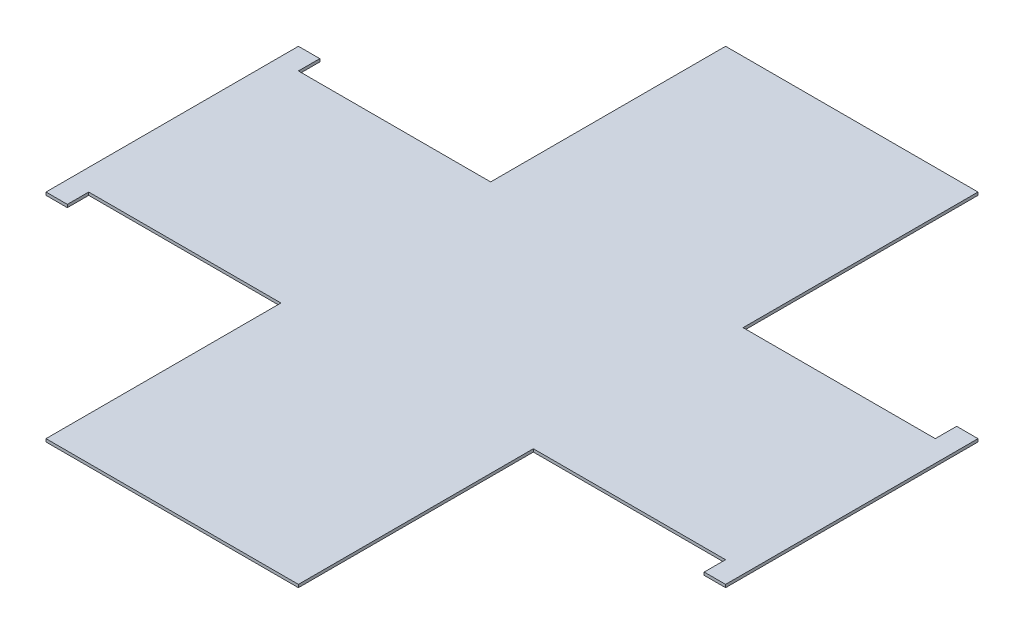
ISO-10303-21;
HEADER;
FILE_DESCRIPTION(('STEP AP214'),'2;1');
FILE_NAME('part.step','',(''),(''),'','','');
FILE_SCHEMA(('AUTOMOTIVE_DESIGN { 1 0 10303 214 1 1 1 1 }'));
ENDSEC;
DATA;
#1=APPLICATION_CONTEXT('core data for automotive mechanical design processes');
#2=APPLICATION_PROTOCOL_DEFINITION('international standard','automotive_design',2000,#1);
#3=PRODUCT_CONTEXT('',#1,'mechanical');
#4=PRODUCT('Part','Part','',(#3));
#5=PRODUCT_RELATED_PRODUCT_CATEGORY('part','',(#4));
#6=PRODUCT_DEFINITION_FORMATION('','',#4);
#7=PRODUCT_DEFINITION_CONTEXT('part definition',#1,'design');
#8=PRODUCT_DEFINITION('design','',#6,#7);
#9=PRODUCT_DEFINITION_SHAPE('','',#8);
#10=(LENGTH_UNIT() NAMED_UNIT(*) SI_UNIT(.MILLI.,.METRE.));
#11=(NAMED_UNIT(*) PLANE_ANGLE_UNIT() SI_UNIT($,.RADIAN.));
#12=(NAMED_UNIT(*) SI_UNIT($,.STERADIAN.) SOLID_ANGLE_UNIT());
#13=UNCERTAINTY_MEASURE_WITH_UNIT(LENGTH_MEASURE(1.E-05),#10,'distance_accuracy_value','');
#14=(GEOMETRIC_REPRESENTATION_CONTEXT(3) GLOBAL_UNCERTAINTY_ASSIGNED_CONTEXT((#13)) GLOBAL_UNIT_ASSIGNED_CONTEXT((#10,
#11,#12)) REPRESENTATION_CONTEXT('',''));
#15=CARTESIAN_POINT('',(0.,0.,0.));
#16=DIRECTION('',(0.,0.,1.));
#17=DIRECTION('',(1.,0.,0.));
#18=AXIS2_PLACEMENT_3D('',#15,#16,#17);
#19=CARTESIAN_POINT('',(-328.,3.,-108.));
#20=DIRECTION('',(0.,0.,1.));
#21=DIRECTION('',(1.,0.,0.));
#22=AXIS2_PLACEMENT_3D('',#19,#20,#21);
#23=PLANE('',#22);
#24=DIRECTION('',(-1.,0.,0.));
#25=VECTOR('',#24,1.);
#26=CARTESIAN_POINT('',(-328.,0.,-108.));
#27=LINE('',#26,#25);
#28=CARTESIAN_POINT('',(-130.,0.,-108.));
#29=VERTEX_POINT('',#28);
#30=CARTESIAN_POINT('',(-328.,0.,-108.));
#31=VERTEX_POINT('',#30);
#32=EDGE_CURVE('E222',#29,#31,#27,.T.);
#33=ORIENTED_EDGE('',*,*,#32,.T.);
#34=DIRECTION('',(0.,-1.,0.));
#35=VECTOR('',#34,1.);
#36=CARTESIAN_POINT('',(-328.,3.,-108.));
#37=LINE('',#36,#35);
#38=CARTESIAN_POINT('',(-328.,3.,-108.));
#39=VERTEX_POINT('',#38);
#40=EDGE_CURVE('E54',#39,#31,#37,.T.);
#41=ORIENTED_EDGE('',*,*,#40,.F.);
#42=DIRECTION('',(-1.,0.,0.));
#43=VECTOR('',#42,1.);
#44=CARTESIAN_POINT('',(-328.,3.,-108.));
#45=LINE('',#44,#43);
#46=CARTESIAN_POINT('',(-130.,3.,-108.));
#47=VERTEX_POINT('',#46);
#48=EDGE_CURVE('E141',#47,#39,#45,.T.);
#49=ORIENTED_EDGE('',*,*,#48,.F.);
#50=DIRECTION('',(0.,-1.,0.));
#51=VECTOR('',#50,1.);
#52=CARTESIAN_POINT('',(-130.,3.,-108.));
#53=LINE('',#52,#51);
#54=EDGE_CURVE('E11',#47,#29,#53,.T.);
#55=ORIENTED_EDGE('',*,*,#54,.T.);
#56=EDGE_LOOP('',(#33,#41,#49,#55));
#57=FACE_BOUND('',#56,.T.);
#58=ADVANCED_FACE('F45',(#57),#23,.F.);
#59=CARTESIAN_POINT('',(-328.,3.,-130.));
#60=DIRECTION('',(-1.,0.,0.));
#61=DIRECTION('',(0.,0.,1.));
#62=AXIS2_PLACEMENT_3D('',#59,#60,#61);
#63=PLANE('',#62);
#64=DIRECTION('',(0.,0.,-1.));
#65=VECTOR('',#64,1.);
#66=CARTESIAN_POINT('',(-328.,0.,-130.));
#67=LINE('',#66,#65);
#68=CARTESIAN_POINT('',(-328.,0.,-130.));
#69=VERTEX_POINT('',#68);
#70=EDGE_CURVE('E225',#31,#69,#67,.T.);
#71=ORIENTED_EDGE('',*,*,#70,.T.);
#72=DIRECTION('',(0.,-1.,0.));
#73=VECTOR('',#72,1.);
#74=CARTESIAN_POINT('',(-328.,3.,-130.));
#75=LINE('',#74,#73);
#76=CARTESIAN_POINT('',(-328.,3.,-130.));
#77=VERTEX_POINT('',#76);
#78=EDGE_CURVE('E339',#77,#69,#75,.T.);
#79=ORIENTED_EDGE('',*,*,#78,.F.);
#80=DIRECTION('',(0.,0.,-1.));
#81=VECTOR('',#80,1.);
#82=CARTESIAN_POINT('',(-328.,3.,-130.));
#83=LINE('',#82,#81);
#84=EDGE_CURVE('E349',#39,#77,#83,.T.);
#85=ORIENTED_EDGE('',*,*,#84,.F.);
#86=ORIENTED_EDGE('',*,*,#40,.T.);
#87=EDGE_LOOP('',(#71,#79,#85,#86));
#88=FACE_BOUND('',#87,.T.);
#89=ADVANCED_FACE('F347',(#88),#63,.F.);
#90=CARTESIAN_POINT('',(-350.,3.,-130.));
#91=DIRECTION('',(0.,0.,1.));
#92=DIRECTION('',(1.,0.,0.));
#93=AXIS2_PLACEMENT_3D('',#90,#91,#92);
#94=PLANE('',#93);
#95=DIRECTION('',(-1.,0.,0.));
#96=VECTOR('',#95,1.);
#97=CARTESIAN_POINT('',(-350.,0.,-130.));
#98=LINE('',#97,#96);
#99=CARTESIAN_POINT('',(-350.,0.,-130.));
#100=VERTEX_POINT('',#99);
#101=EDGE_CURVE('E228',#69,#100,#98,.T.);
#102=ORIENTED_EDGE('',*,*,#101,.T.);
#103=DIRECTION('',(0.,-1.,0.));
#104=VECTOR('',#103,1.);
#105=CARTESIAN_POINT('',(-350.,3.,-130.));
#106=LINE('',#105,#104);
#107=CARTESIAN_POINT('',(-350.,3.,-130.));
#108=VERTEX_POINT('',#107);
#109=EDGE_CURVE('E335',#108,#100,#106,.T.);
#110=ORIENTED_EDGE('',*,*,#109,.F.);
#111=DIRECTION('',(-1.,0.,0.));
#112=VECTOR('',#111,1.);
#113=CARTESIAN_POINT('',(-350.,3.,-130.));
#114=LINE('',#113,#112);
#115=EDGE_CURVE('E369',#77,#108,#114,.T.);
#116=ORIENTED_EDGE('',*,*,#115,.F.);
#117=ORIENTED_EDGE('',*,*,#78,.T.);
#118=EDGE_LOOP('',(#102,#110,#116,#117));
#119=FACE_BOUND('',#118,.T.);
#120=ADVANCED_FACE('F359',(#119),#94,.F.);
#121=CARTESIAN_POINT('',(-350.,3.,130.));
#122=DIRECTION('',(1.,0.,0.));
#123=DIRECTION('',(0.,0.,-1.));
#124=AXIS2_PLACEMENT_3D('',#121,#122,#123);
#125=PLANE('',#124);
#126=DIRECTION('',(0.,0.,1.));
#127=VECTOR('',#126,1.);
#128=CARTESIAN_POINT('',(-350.,0.,130.));
#129=LINE('',#128,#127);
#130=CARTESIAN_POINT('',(-350.,0.,130.));
#131=VERTEX_POINT('',#130);
#132=EDGE_CURVE('E231',#100,#131,#129,.T.);
#133=ORIENTED_EDGE('',*,*,#132,.T.);
#134=DIRECTION('',(0.,-1.,0.));
#135=VECTOR('',#134,1.);
#136=CARTESIAN_POINT('',(-350.,3.,130.));
#137=LINE('',#136,#135);
#138=CARTESIAN_POINT('',(-350.,3.,130.));
#139=VERTEX_POINT('',#138);
#140=EDGE_CURVE('E331',#139,#131,#137,.T.);
#141=ORIENTED_EDGE('',*,*,#140,.F.);
#142=DIRECTION('',(0.,0.,1.));
#143=VECTOR('',#142,1.);
#144=CARTESIAN_POINT('',(-350.,3.,130.));
#145=LINE('',#144,#143);
#146=EDGE_CURVE('E365',#108,#139,#145,.T.);
#147=ORIENTED_EDGE('',*,*,#146,.F.);
#148=ORIENTED_EDGE('',*,*,#109,.T.);
#149=EDGE_LOOP('',(#133,#141,#147,#148));
#150=FACE_BOUND('',#149,.T.);
#151=ADVANCED_FACE('F363',(#150),#125,.F.);
#152=CARTESIAN_POINT('',(-350.,3.,130.));
#153=DIRECTION('',(0.,0.,-1.));
#154=DIRECTION('',(-1.,0.,0.));
#155=AXIS2_PLACEMENT_3D('',#152,#153,#154);
#156=PLANE('',#155);
#157=DIRECTION('',(1.,0.,0.));
#158=VECTOR('',#157,1.);
#159=CARTESIAN_POINT('',(-350.,0.,130.));
#160=LINE('',#159,#158);
#161=CARTESIAN_POINT('',(-328.,0.,130.));
#162=VERTEX_POINT('',#161);
#163=EDGE_CURVE('E234',#131,#162,#160,.T.);
#164=ORIENTED_EDGE('',*,*,#163,.T.);
#165=DIRECTION('',(0.,-1.,0.));
#166=VECTOR('',#165,1.);
#167=CARTESIAN_POINT('',(-328.,3.,130.));
#168=LINE('',#167,#166);
#169=CARTESIAN_POINT('',(-328.,3.,130.));
#170=VERTEX_POINT('',#169);
#171=EDGE_CURVE('E327',#170,#162,#168,.T.);
#172=ORIENTED_EDGE('',*,*,#171,.F.);
#173=DIRECTION('',(1.,0.,0.));
#174=VECTOR('',#173,1.);
#175=CARTESIAN_POINT('',(-350.,3.,130.));
#176=LINE('',#175,#174);
#177=EDGE_CURVE('E368',#139,#170,#176,.T.);
#178=ORIENTED_EDGE('',*,*,#177,.F.);
#179=ORIENTED_EDGE('',*,*,#140,.T.);
#180=EDGE_LOOP('',(#164,#172,#178,#179));
#181=FACE_BOUND('',#180,.T.);
#182=ADVANCED_FACE('F443',(#181),#156,.F.);
#183=CARTESIAN_POINT('',(-328.,3.,108.));
#184=DIRECTION('',(-1.,0.,0.));
#185=DIRECTION('',(0.,0.,1.));
#186=AXIS2_PLACEMENT_3D('',#183,#184,#185);
#187=PLANE('',#186);
#188=DIRECTION('',(0.,0.,-1.));
#189=VECTOR('',#188,1.);
#190=CARTESIAN_POINT('',(-328.,0.,108.));
#191=LINE('',#190,#189);
#192=CARTESIAN_POINT('',(-328.,0.,108.));
#193=VERTEX_POINT('',#192);
#194=EDGE_CURVE('E237',#162,#193,#191,.T.);
#195=ORIENTED_EDGE('',*,*,#194,.T.);
#196=DIRECTION('',(0.,-1.,0.));
#197=VECTOR('',#196,1.);
#198=CARTESIAN_POINT('',(-328.,3.,108.));
#199=LINE('',#198,#197);
#200=CARTESIAN_POINT('',(-328.,3.,108.));
#201=VERTEX_POINT('',#200);
#202=EDGE_CURVE('E323',#201,#193,#199,.T.);
#203=ORIENTED_EDGE('',*,*,#202,.F.);
#204=DIRECTION('',(0.,0.,-1.));
#205=VECTOR('',#204,1.);
#206=CARTESIAN_POINT('',(-328.,3.,108.));
#207=LINE('',#206,#205);
#208=EDGE_CURVE('E373',#170,#201,#207,.T.);
#209=ORIENTED_EDGE('',*,*,#208,.F.);
#210=ORIENTED_EDGE('',*,*,#171,.T.);
#211=EDGE_LOOP('',(#195,#203,#209,#210));
#212=FACE_BOUND('',#211,.T.);
#213=ADVANCED_FACE('F446',(#212),#187,.F.);
#214=CARTESIAN_POINT('',(-328.,3.,108.));
#215=DIRECTION('',(0.,0.,-1.));
#216=DIRECTION('',(-1.,0.,0.));
#217=AXIS2_PLACEMENT_3D('',#214,#215,#216);
#218=PLANE('',#217);
#219=DIRECTION('',(1.,0.,0.));
#220=VECTOR('',#219,1.);
#221=CARTESIAN_POINT('',(-328.,0.,108.));
#222=LINE('',#221,#220);
#223=CARTESIAN_POINT('',(-130.,0.,108.));
#224=VERTEX_POINT('',#223);
#225=EDGE_CURVE('E240',#193,#224,#222,.T.);
#226=ORIENTED_EDGE('',*,*,#225,.T.);
#227=DIRECTION('',(0.,-1.,0.));
#228=VECTOR('',#227,1.);
#229=CARTESIAN_POINT('',(-130.,3.,108.));
#230=LINE('',#229,#228);
#231=CARTESIAN_POINT('',(-130.,3.,108.));
#232=VERTEX_POINT('',#231);
#233=EDGE_CURVE('E319',#232,#224,#230,.T.);
#234=ORIENTED_EDGE('',*,*,#233,.F.);
#235=DIRECTION('',(1.,0.,0.));
#236=VECTOR('',#235,1.);
#237=CARTESIAN_POINT('',(-328.,3.,108.));
#238=LINE('',#237,#236);
#239=EDGE_CURVE('E380',#201,#232,#238,.T.);
#240=ORIENTED_EDGE('',*,*,#239,.F.);
#241=ORIENTED_EDGE('',*,*,#202,.T.);
#242=EDGE_LOOP('',(#226,#234,#240,#241));
#243=FACE_BOUND('',#242,.T.);
#244=ADVANCED_FACE('F450',(#243),#218,.F.);
#245=CARTESIAN_POINT('',(-130.,3.,130.));
#246=DIRECTION('',(1.,0.,0.));
#247=DIRECTION('',(0.,0.,-1.));
#248=AXIS2_PLACEMENT_3D('',#245,#246,#247);
#249=PLANE('',#248);
#250=DIRECTION('',(0.,0.,1.));
#251=VECTOR('',#250,1.);
#252=CARTESIAN_POINT('',(-130.,0.,130.));
#253=LINE('',#252,#251);
#254=CARTESIAN_POINT('',(-130.,0.,350.));
#255=VERTEX_POINT('',#254);
#256=EDGE_CURVE('E244',#224,#255,#253,.T.);
#257=ORIENTED_EDGE('',*,*,#256,.T.);
#258=DIRECTION('',(0.,-1.,0.));
#259=VECTOR('',#258,1.);
#260=CARTESIAN_POINT('',(-130.,3.,350.));
#261=LINE('',#260,#259);
#262=CARTESIAN_POINT('',(-130.,3.,350.));
#263=VERTEX_POINT('',#262);
#264=EDGE_CURVE('E315',#263,#255,#261,.T.);
#265=ORIENTED_EDGE('',*,*,#264,.F.);
#266=DIRECTION('',(0.,0.,1.));
#267=VECTOR('',#266,1.);
#268=CARTESIAN_POINT('',(-130.,3.,108.));
#269=LINE('',#268,#267);
#270=EDGE_CURVE('E383',#232,#263,#269,.T.);
#271=ORIENTED_EDGE('',*,*,#270,.F.);
#272=ORIENTED_EDGE('',*,*,#233,.T.);
#273=EDGE_LOOP('',(#257,#265,#271,#272));
#274=FACE_BOUND('',#273,.T.);
#275=ADVANCED_FACE('F454',(#274),#249,.F.);
#276=CARTESIAN_POINT('',(-130.,3.,350.));
#277=DIRECTION('',(0.,0.,-1.));
#278=DIRECTION('',(-1.,0.,0.));
#279=AXIS2_PLACEMENT_3D('',#276,#277,#278);
#280=PLANE('',#279);
#281=DIRECTION('',(1.,0.,0.));
#282=VECTOR('',#281,1.);
#283=CARTESIAN_POINT('',(-130.,0.,350.));
#284=LINE('',#283,#282);
#285=CARTESIAN_POINT('',(130.,0.,350.));
#286=VERTEX_POINT('',#285);
#287=EDGE_CURVE('E247',#255,#286,#284,.T.);
#288=ORIENTED_EDGE('',*,*,#287,.T.);
#289=DIRECTION('',(0.,-1.,0.));
#290=VECTOR('',#289,1.);
#291=CARTESIAN_POINT('',(130.,3.,350.));
#292=LINE('',#291,#290);
#293=CARTESIAN_POINT('',(130.,3.,350.));
#294=VERTEX_POINT('',#293);
#295=EDGE_CURVE('E311',#294,#286,#292,.T.);
#296=ORIENTED_EDGE('',*,*,#295,.F.);
#297=DIRECTION('',(1.,0.,0.));
#298=VECTOR('',#297,1.);
#299=CARTESIAN_POINT('',(-130.,3.,350.));
#300=LINE('',#299,#298);
#301=EDGE_CURVE('E386',#263,#294,#300,.T.);
#302=ORIENTED_EDGE('',*,*,#301,.F.);
#303=ORIENTED_EDGE('',*,*,#264,.T.);
#304=EDGE_LOOP('',(#288,#296,#302,#303));
#305=FACE_BOUND('',#304,.T.);
#306=ADVANCED_FACE('F458',(#305),#280,.F.);
#307=CARTESIAN_POINT('',(130.,3.,108.));
#308=DIRECTION('',(-1.,0.,0.));
#309=DIRECTION('',(0.,0.,1.));
#310=AXIS2_PLACEMENT_3D('',#307,#308,#309);
#311=PLANE('',#310);
#312=DIRECTION('',(0.,0.,-1.));
#313=VECTOR('',#312,1.);
#314=CARTESIAN_POINT('',(130.,0.,108.));
#315=LINE('',#314,#313);
#316=CARTESIAN_POINT('',(130.,0.,108.));
#317=VERTEX_POINT('',#316);
#318=EDGE_CURVE('E251',#286,#317,#315,.T.);
#319=ORIENTED_EDGE('',*,*,#318,.T.);
#320=DIRECTION('',(0.,-1.,0.));
#321=VECTOR('',#320,1.);
#322=CARTESIAN_POINT('',(130.,3.,108.));
#323=LINE('',#322,#321);
#324=CARTESIAN_POINT('',(130.,3.,108.));
#325=VERTEX_POINT('',#324);
#326=EDGE_CURVE('E307',#325,#317,#323,.T.);
#327=ORIENTED_EDGE('',*,*,#326,.F.);
#328=DIRECTION('',(0.,0.,-1.));
#329=VECTOR('',#328,1.);
#330=CARTESIAN_POINT('',(130.,3.,130.));
#331=LINE('',#330,#329);
#332=EDGE_CURVE('E389',#294,#325,#331,.T.);
#333=ORIENTED_EDGE('',*,*,#332,.F.);
#334=ORIENTED_EDGE('',*,*,#295,.T.);
#335=EDGE_LOOP('',(#319,#327,#333,#334));
#336=FACE_BOUND('',#335,.T.);
#337=ADVANCED_FACE('F462',(#336),#311,.F.);
#338=CARTESIAN_POINT('',(130.,3.,108.));
#339=DIRECTION('',(0.,0.,-1.));
#340=DIRECTION('',(-1.,0.,0.));
#341=AXIS2_PLACEMENT_3D('',#338,#339,#340);
#342=PLANE('',#341);
#343=DIRECTION('',(1.,0.,0.));
#344=VECTOR('',#343,1.);
#345=CARTESIAN_POINT('',(130.,0.,108.));
#346=LINE('',#345,#344);
#347=CARTESIAN_POINT('',(328.,0.,108.));
#348=VERTEX_POINT('',#347);
#349=EDGE_CURVE('E254',#317,#348,#346,.T.);
#350=ORIENTED_EDGE('',*,*,#349,.T.);
#351=DIRECTION('',(0.,-1.,0.));
#352=VECTOR('',#351,1.);
#353=CARTESIAN_POINT('',(328.,3.,108.));
#354=LINE('',#353,#352);
#355=CARTESIAN_POINT('',(328.,3.,108.));
#356=VERTEX_POINT('',#355);
#357=EDGE_CURVE('E303',#356,#348,#354,.T.);
#358=ORIENTED_EDGE('',*,*,#357,.F.);
#359=DIRECTION('',(1.,0.,0.));
#360=VECTOR('',#359,1.);
#361=CARTESIAN_POINT('',(130.,3.,108.));
#362=LINE('',#361,#360);
#363=EDGE_CURVE('E392',#325,#356,#362,.T.);
#364=ORIENTED_EDGE('',*,*,#363,.F.);
#365=ORIENTED_EDGE('',*,*,#326,.T.);
#366=EDGE_LOOP('',(#350,#358,#364,#365));
#367=FACE_BOUND('',#366,.T.);
#368=ADVANCED_FACE('F466',(#367),#342,.F.);
#369=CARTESIAN_POINT('',(328.,3.,108.));
#370=DIRECTION('',(1.,0.,0.));
#371=DIRECTION('',(0.,0.,-1.));
#372=AXIS2_PLACEMENT_3D('',#369,#370,#371);
#373=PLANE('',#372);
#374=DIRECTION('',(0.,0.,1.));
#375=VECTOR('',#374,1.);
#376=CARTESIAN_POINT('',(328.,0.,108.));
#377=LINE('',#376,#375);
#378=CARTESIAN_POINT('',(328.,0.,130.));
#379=VERTEX_POINT('',#378);
#380=EDGE_CURVE('E257',#348,#379,#377,.T.);
#381=ORIENTED_EDGE('',*,*,#380,.T.);
#382=DIRECTION('',(0.,-1.,0.));
#383=VECTOR('',#382,1.);
#384=CARTESIAN_POINT('',(328.,3.,130.));
#385=LINE('',#384,#383);
#386=CARTESIAN_POINT('',(328.,3.,130.));
#387=VERTEX_POINT('',#386);
#388=EDGE_CURVE('E299',#387,#379,#385,.T.);
#389=ORIENTED_EDGE('',*,*,#388,.F.);
#390=DIRECTION('',(0.,0.,1.));
#391=VECTOR('',#390,1.);
#392=CARTESIAN_POINT('',(328.,3.,108.));
#393=LINE('',#392,#391);
#394=EDGE_CURVE('E395',#356,#387,#393,.T.);
#395=ORIENTED_EDGE('',*,*,#394,.F.);
#396=ORIENTED_EDGE('',*,*,#357,.T.);
#397=EDGE_LOOP('',(#381,#389,#395,#396));
#398=FACE_BOUND('',#397,.T.);
#399=ADVANCED_FACE('F470',(#398),#373,.F.);
#400=CARTESIAN_POINT('',(328.,3.,130.));
#401=DIRECTION('',(0.,0.,-1.));
#402=DIRECTION('',(-1.,0.,0.));
#403=AXIS2_PLACEMENT_3D('',#400,#401,#402);
#404=PLANE('',#403);
#405=DIRECTION('',(1.,0.,0.));
#406=VECTOR('',#405,1.);
#407=CARTESIAN_POINT('',(328.,0.,130.));
#408=LINE('',#407,#406);
#409=CARTESIAN_POINT('',(350.,0.,130.));
#410=VERTEX_POINT('',#409);
#411=EDGE_CURVE('E260',#379,#410,#408,.T.);
#412=ORIENTED_EDGE('',*,*,#411,.T.);
#413=DIRECTION('',(0.,-1.,0.));
#414=VECTOR('',#413,1.);
#415=CARTESIAN_POINT('',(350.,3.,130.));
#416=LINE('',#415,#414);
#417=CARTESIAN_POINT('',(350.,3.,130.));
#418=VERTEX_POINT('',#417);
#419=EDGE_CURVE('E295',#418,#410,#416,.T.);
#420=ORIENTED_EDGE('',*,*,#419,.F.);
#421=DIRECTION('',(1.,0.,0.));
#422=VECTOR('',#421,1.);
#423=CARTESIAN_POINT('',(328.,3.,130.));
#424=LINE('',#423,#422);
#425=EDGE_CURVE('E398',#387,#418,#424,.T.);
#426=ORIENTED_EDGE('',*,*,#425,.F.);
#427=ORIENTED_EDGE('',*,*,#388,.T.);
#428=EDGE_LOOP('',(#412,#420,#426,#427));
#429=FACE_BOUND('',#428,.T.);
#430=ADVANCED_FACE('F474',(#429),#404,.F.);
#431=CARTESIAN_POINT('',(350.,3.,130.));
#432=DIRECTION('',(-1.,0.,0.));
#433=DIRECTION('',(0.,0.,1.));
#434=AXIS2_PLACEMENT_3D('',#431,#432,#433);
#435=PLANE('',#434);
#436=DIRECTION('',(0.,0.,-1.));
#437=VECTOR('',#436,1.);
#438=CARTESIAN_POINT('',(350.,0.,130.));
#439=LINE('',#438,#437);
#440=CARTESIAN_POINT('',(350.,0.,-130.));
#441=VERTEX_POINT('',#440);
#442=EDGE_CURVE('E263',#410,#441,#439,.T.);
#443=ORIENTED_EDGE('',*,*,#442,.T.);
#444=DIRECTION('',(0.,-1.,0.));
#445=VECTOR('',#444,1.);
#446=CARTESIAN_POINT('',(350.,3.,-130.));
#447=LINE('',#446,#445);
#448=CARTESIAN_POINT('',(350.,3.,-130.));
#449=VERTEX_POINT('',#448);
#450=EDGE_CURVE('E291',#449,#441,#447,.T.);
#451=ORIENTED_EDGE('',*,*,#450,.F.);
#452=DIRECTION('',(0.,0.,-1.));
#453=VECTOR('',#452,1.);
#454=CARTESIAN_POINT('',(350.,3.,130.));
#455=LINE('',#454,#453);
#456=EDGE_CURVE('E401',#418,#449,#455,.T.);
#457=ORIENTED_EDGE('',*,*,#456,.F.);
#458=ORIENTED_EDGE('',*,*,#419,.T.);
#459=EDGE_LOOP('',(#443,#451,#457,#458));
#460=FACE_BOUND('',#459,.T.);
#461=ADVANCED_FACE('F478',(#460),#435,.F.);
#462=CARTESIAN_POINT('',(328.,3.,-130.));
#463=DIRECTION('',(0.,0.,1.));
#464=DIRECTION('',(1.,0.,0.));
#465=AXIS2_PLACEMENT_3D('',#462,#463,#464);
#466=PLANE('',#465);
#467=DIRECTION('',(-1.,0.,0.));
#468=VECTOR('',#467,1.);
#469=CARTESIAN_POINT('',(328.,0.,-130.));
#470=LINE('',#469,#468);
#471=CARTESIAN_POINT('',(328.,0.,-130.));
#472=VERTEX_POINT('',#471);
#473=EDGE_CURVE('E266',#441,#472,#470,.T.);
#474=ORIENTED_EDGE('',*,*,#473,.T.);
#475=DIRECTION('',(0.,-1.,0.));
#476=VECTOR('',#475,1.);
#477=CARTESIAN_POINT('',(328.,3.,-130.));
#478=LINE('',#477,#476);
#479=CARTESIAN_POINT('',(328.,3.,-130.));
#480=VERTEX_POINT('',#479);
#481=EDGE_CURVE('E287',#480,#472,#478,.T.);
#482=ORIENTED_EDGE('',*,*,#481,.F.);
#483=DIRECTION('',(-1.,0.,0.));
#484=VECTOR('',#483,1.);
#485=CARTESIAN_POINT('',(328.,3.,-130.));
#486=LINE('',#485,#484);
#487=EDGE_CURVE('E404',#449,#480,#486,.T.);
#488=ORIENTED_EDGE('',*,*,#487,.F.);
#489=ORIENTED_EDGE('',*,*,#450,.T.);
#490=EDGE_LOOP('',(#474,#482,#488,#489));
#491=FACE_BOUND('',#490,.T.);
#492=ADVANCED_FACE('F412',(#491),#466,.F.);
#493=CARTESIAN_POINT('',(328.,3.,-130.));
#494=DIRECTION('',(1.,0.,0.));
#495=DIRECTION('',(0.,0.,-1.));
#496=AXIS2_PLACEMENT_3D('',#493,#494,#495);
#497=PLANE('',#496);
#498=DIRECTION('',(0.,0.,1.));
#499=VECTOR('',#498,1.);
#500=CARTESIAN_POINT('',(328.,0.,-130.));
#501=LINE('',#500,#499);
#502=CARTESIAN_POINT('',(328.,0.,-108.));
#503=VERTEX_POINT('',#502);
#504=EDGE_CURVE('E269',#472,#503,#501,.T.);
#505=ORIENTED_EDGE('',*,*,#504,.T.);
#506=DIRECTION('',(0.,-1.,0.));
#507=VECTOR('',#506,1.);
#508=CARTESIAN_POINT('',(328.,3.,-108.));
#509=LINE('',#508,#507);
#510=CARTESIAN_POINT('',(328.,3.,-108.));
#511=VERTEX_POINT('',#510);
#512=EDGE_CURVE('E209',#511,#503,#509,.T.);
#513=ORIENTED_EDGE('',*,*,#512,.F.);
#514=DIRECTION('',(0.,0.,1.));
#515=VECTOR('',#514,1.);
#516=CARTESIAN_POINT('',(328.,3.,-130.));
#517=LINE('',#516,#515);
#518=EDGE_CURVE('E197',#480,#511,#517,.T.);
#519=ORIENTED_EDGE('',*,*,#518,.F.);
#520=ORIENTED_EDGE('',*,*,#481,.T.);
#521=EDGE_LOOP('',(#505,#513,#519,#520));
#522=FACE_BOUND('',#521,.T.);
#523=ADVANCED_FACE('F416',(#522),#497,.F.);
#524=CARTESIAN_POINT('',(130.,3.,-108.));
#525=DIRECTION('',(0.,0.,1.));
#526=DIRECTION('',(1.,0.,0.));
#527=AXIS2_PLACEMENT_3D('',#524,#525,#526);
#528=PLANE('',#527);
#529=DIRECTION('',(-1.,0.,0.));
#530=VECTOR('',#529,1.);
#531=CARTESIAN_POINT('',(130.,0.,-108.));
#532=LINE('',#531,#530);
#533=CARTESIAN_POINT('',(130.,0.,-108.));
#534=VERTEX_POINT('',#533);
#535=EDGE_CURVE('E207',#503,#534,#532,.T.);
#536=ORIENTED_EDGE('',*,*,#535,.T.);
#537=DIRECTION('',(0.,-1.,0.));
#538=VECTOR('',#537,1.);
#539=CARTESIAN_POINT('',(130.,3.,-108.));
#540=LINE('',#539,#538);
#541=CARTESIAN_POINT('',(130.,3.,-108.));
#542=VERTEX_POINT('',#541);
#543=EDGE_CURVE('E204',#542,#534,#540,.T.);
#544=ORIENTED_EDGE('',*,*,#543,.F.);
#545=DIRECTION('',(-1.,0.,0.));
#546=VECTOR('',#545,1.);
#547=CARTESIAN_POINT('',(130.,3.,-108.));
#548=LINE('',#547,#546);
#549=EDGE_CURVE('E191',#511,#542,#548,.T.);
#550=ORIENTED_EDGE('',*,*,#549,.F.);
#551=ORIENTED_EDGE('',*,*,#512,.T.);
#552=EDGE_LOOP('',(#536,#544,#550,#551));
#553=FACE_BOUND('',#552,.T.);
#554=ADVANCED_FACE('F205',(#553),#528,.F.);
#555=CARTESIAN_POINT('',(130.,3.,-350.));
#556=DIRECTION('',(-1.,0.,0.));
#557=DIRECTION('',(0.,0.,1.));
#558=AXIS2_PLACEMENT_3D('',#555,#556,#557);
#559=PLANE('',#558);
#560=DIRECTION('',(0.,0.,-1.));
#561=VECTOR('',#560,1.);
#562=CARTESIAN_POINT('',(130.,0.,-350.));
#563=LINE('',#562,#561);
#564=CARTESIAN_POINT('',(130.,0.,-350.));
#565=VERTEX_POINT('',#564);
#566=EDGE_CURVE('E127',#534,#565,#563,.T.);
#567=ORIENTED_EDGE('',*,*,#566,.T.);
#568=DIRECTION('',(0.,-1.,0.));
#569=VECTOR('',#568,1.);
#570=CARTESIAN_POINT('',(130.,3.,-350.));
#571=LINE('',#570,#569);
#572=CARTESIAN_POINT('',(130.,3.,-350.));
#573=VERTEX_POINT('',#572);
#574=EDGE_CURVE('E210',#573,#565,#571,.T.);
#575=ORIENTED_EDGE('',*,*,#574,.F.);
#576=DIRECTION('',(0.,0.,-1.));
#577=VECTOR('',#576,1.);
#578=CARTESIAN_POINT('',(130.,3.,-130.));
#579=LINE('',#578,#577);
#580=EDGE_CURVE('E195',#542,#573,#579,.T.);
#581=ORIENTED_EDGE('',*,*,#580,.F.);
#582=ORIENTED_EDGE('',*,*,#543,.T.);
#583=EDGE_LOOP('',(#567,#575,#581,#582));
#584=FACE_BOUND('',#583,.T.);
#585=ADVANCED_FACE('F212',(#584),#559,.F.);
#586=CARTESIAN_POINT('',(-130.,3.,-350.));
#587=DIRECTION('',(0.,0.,1.));
#588=DIRECTION('',(1.,0.,0.));
#589=AXIS2_PLACEMENT_3D('',#586,#587,#588);
#590=PLANE('',#589);
#591=DIRECTION('',(-1.,0.,0.));
#592=VECTOR('',#591,1.);
#593=CARTESIAN_POINT('',(-130.,0.,-350.));
#594=LINE('',#593,#592);
#595=CARTESIAN_POINT('',(-130.,0.,-350.));
#596=VERTEX_POINT('',#595);
#597=EDGE_CURVE('E134',#565,#596,#594,.T.);
#598=ORIENTED_EDGE('',*,*,#597,.T.);
#599=DIRECTION('',(0.,-1.,0.));
#600=VECTOR('',#599,1.);
#601=CARTESIAN_POINT('',(-130.,3.,-350.));
#602=LINE('',#601,#600);
#603=CARTESIAN_POINT('',(-130.,3.,-350.));
#604=VERTEX_POINT('',#603);
#605=EDGE_CURVE('E218',#604,#596,#602,.T.);
#606=ORIENTED_EDGE('',*,*,#605,.F.);
#607=DIRECTION('',(-1.,0.,0.));
#608=VECTOR('',#607,1.);
#609=CARTESIAN_POINT('',(-130.,3.,-350.));
#610=LINE('',#609,#608);
#611=EDGE_CURVE('E215',#573,#604,#610,.T.);
#612=ORIENTED_EDGE('',*,*,#611,.F.);
#613=ORIENTED_EDGE('',*,*,#574,.T.);
#614=EDGE_LOOP('',(#598,#606,#612,#613));
#615=FACE_BOUND('',#614,.T.);
#616=ADVANCED_FACE('F418',(#615),#590,.F.);
#617=CARTESIAN_POINT('',(-130.,3.,-350.));
#618=DIRECTION('',(1.,0.,0.));
#619=DIRECTION('',(0.,0.,-1.));
#620=AXIS2_PLACEMENT_3D('',#617,#618,#619);
#621=PLANE('',#620);
#622=DIRECTION('',(0.,0.,1.));
#623=VECTOR('',#622,1.);
#624=CARTESIAN_POINT('',(-130.,0.,-350.));
#625=LINE('',#624,#623);
#626=EDGE_CURVE('E278',#596,#29,#625,.T.);
#627=ORIENTED_EDGE('',*,*,#626,.T.);
#628=ORIENTED_EDGE('',*,*,#54,.F.);
#629=DIRECTION('',(0.,0.,1.));
#630=VECTOR('',#629,1.);
#631=CARTESIAN_POINT('',(-130.,3.,-130.));
#632=LINE('',#631,#630);
#633=EDGE_CURVE('E62',#604,#47,#632,.T.);
#634=ORIENTED_EDGE('',*,*,#633,.F.);
#635=ORIENTED_EDGE('',*,*,#605,.T.);
#636=EDGE_LOOP('',(#627,#628,#634,#635));
#637=FACE_BOUND('',#636,.T.);
#638=ADVANCED_FACE('F417',(#637),#621,.F.);
#639=CARTESIAN_POINT('',(0.,3.,0.));
#640=DIRECTION('',(0.,1.,0.));
#641=DIRECTION('',(0.,0.,1.));
#642=AXIS2_PLACEMENT_3D('',#639,#640,#641);
#643=PLANE('',#642);
#644=ORIENTED_EDGE('',*,*,#633,.T.);
#645=ORIENTED_EDGE('',*,*,#48,.T.);
#646=ORIENTED_EDGE('',*,*,#84,.T.);
#647=ORIENTED_EDGE('',*,*,#115,.T.);
#648=ORIENTED_EDGE('',*,*,#146,.T.);
#649=ORIENTED_EDGE('',*,*,#177,.T.);
#650=ORIENTED_EDGE('',*,*,#208,.T.);
#651=ORIENTED_EDGE('',*,*,#239,.T.);
#652=ORIENTED_EDGE('',*,*,#270,.T.);
#653=ORIENTED_EDGE('',*,*,#301,.T.);
#654=ORIENTED_EDGE('',*,*,#332,.T.);
#655=ORIENTED_EDGE('',*,*,#363,.T.);
#656=ORIENTED_EDGE('',*,*,#394,.T.);
#657=ORIENTED_EDGE('',*,*,#425,.T.);
#658=ORIENTED_EDGE('',*,*,#456,.T.);
#659=ORIENTED_EDGE('',*,*,#487,.T.);
#660=ORIENTED_EDGE('',*,*,#518,.T.);
#661=ORIENTED_EDGE('',*,*,#549,.T.);
#662=ORIENTED_EDGE('',*,*,#580,.T.);
#663=ORIENTED_EDGE('',*,*,#611,.T.);
#664=EDGE_LOOP('',(#644,#645,#646,#647,#648,#649,#650,#651,#652,#653,#654,#655,#656,#657,#658,
#659,#660,#661,#662,#663));
#665=FACE_BOUND('',#664,.T.);
#666=ADVANCED_FACE('F193',(#665),#643,.T.);
#667=CARTESIAN_POINT('',(0.,0.,0.));
#668=DIRECTION('',(0.,1.,0.));
#669=DIRECTION('',(0.,0.,1.));
#670=AXIS2_PLACEMENT_3D('',#667,#668,#669);
#671=PLANE('',#670);
#672=ORIENTED_EDGE('',*,*,#32,.F.);
#673=ORIENTED_EDGE('',*,*,#626,.F.);
#674=ORIENTED_EDGE('',*,*,#597,.F.);
#675=ORIENTED_EDGE('',*,*,#566,.F.);
#676=ORIENTED_EDGE('',*,*,#535,.F.);
#677=ORIENTED_EDGE('',*,*,#504,.F.);
#678=ORIENTED_EDGE('',*,*,#473,.F.);
#679=ORIENTED_EDGE('',*,*,#442,.F.);
#680=ORIENTED_EDGE('',*,*,#411,.F.);
#681=ORIENTED_EDGE('',*,*,#380,.F.);
#682=ORIENTED_EDGE('',*,*,#349,.F.);
#683=ORIENTED_EDGE('',*,*,#318,.F.);
#684=ORIENTED_EDGE('',*,*,#287,.F.);
#685=ORIENTED_EDGE('',*,*,#256,.F.);
#686=ORIENTED_EDGE('',*,*,#225,.F.);
#687=ORIENTED_EDGE('',*,*,#194,.F.);
#688=ORIENTED_EDGE('',*,*,#163,.F.);
#689=ORIENTED_EDGE('',*,*,#132,.F.);
#690=ORIENTED_EDGE('',*,*,#101,.F.);
#691=ORIENTED_EDGE('',*,*,#70,.F.);
#692=EDGE_LOOP('',(#672,#673,#674,#675,#676,#677,#678,#679,#680,#681,#682,#683,#684,#685,#686,
#687,#688,#689,#690,#691));
#693=FACE_BOUND('',#692,.T.);
#694=ADVANCED_FACE('F353',(#693),#671,.F.);
#695=CLOSED_SHELL('',(#58,#89,#120,#151,#182,#213,#244,#275,#306,#337,#368,#399,#430,#461,#492,
#523,#554,#585,#616,#638,#666,#694));
#696=MANIFOLD_SOLID_BREP('B2',#695);
#697=ADVANCED_BREP_SHAPE_REPRESENTATION('',(#18,#696),#14);
#698=SHAPE_DEFINITION_REPRESENTATION(#9,#697);
ENDSEC;
END-ISO-10303-21;
